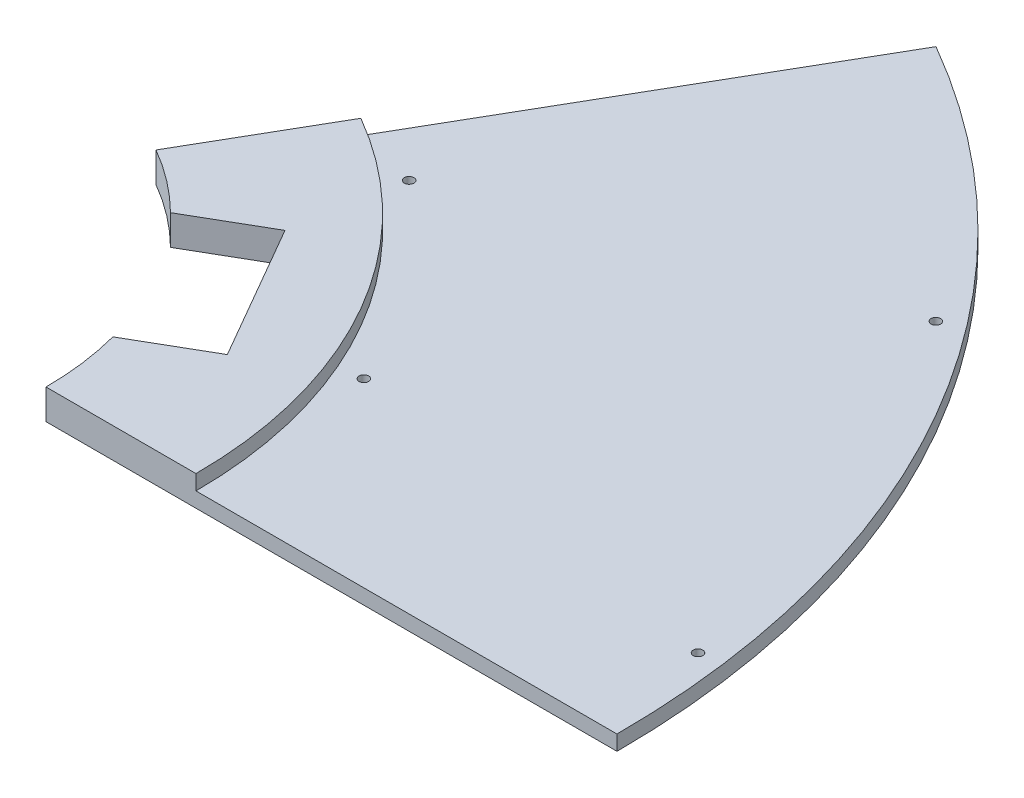
ISO-10303-21;
HEADER;
FILE_DESCRIPTION(('STEP AP214'),'2;1');
FILE_NAME('part.step','',(''),(''),'','','');
FILE_SCHEMA(('AUTOMOTIVE_DESIGN { 1 0 10303 214 1 1 1 1 }'));
ENDSEC;
DATA;
#1=APPLICATION_CONTEXT('core data for automotive mechanical design processes');
#2=APPLICATION_PROTOCOL_DEFINITION('international standard','automotive_design',2000,#1);
#3=PRODUCT_CONTEXT('',#1,'mechanical');
#4=PRODUCT('Part','Part','',(#3));
#5=PRODUCT_RELATED_PRODUCT_CATEGORY('part','',(#4));
#6=PRODUCT_DEFINITION_FORMATION('','',#4);
#7=PRODUCT_DEFINITION_CONTEXT('part definition',#1,'design');
#8=PRODUCT_DEFINITION('design','',#6,#7);
#9=PRODUCT_DEFINITION_SHAPE('','',#8);
#10=(LENGTH_UNIT() NAMED_UNIT(*) SI_UNIT(.MILLI.,.METRE.));
#11=(NAMED_UNIT(*) PLANE_ANGLE_UNIT() SI_UNIT($,.RADIAN.));
#12=(NAMED_UNIT(*) SI_UNIT($,.STERADIAN.) SOLID_ANGLE_UNIT());
#13=UNCERTAINTY_MEASURE_WITH_UNIT(LENGTH_MEASURE(1.E-05),#10,'distance_accuracy_value','');
#14=(GEOMETRIC_REPRESENTATION_CONTEXT(3) GLOBAL_UNCERTAINTY_ASSIGNED_CONTEXT((#13)) GLOBAL_UNIT_ASSIGNED_CONTEXT((#10,
#11,#12)) REPRESENTATION_CONTEXT('',''));
#15=CARTESIAN_POINT('',(0.,0.,0.));
#16=DIRECTION('',(0.,0.,1.));
#17=DIRECTION('',(1.,0.,0.));
#18=AXIS2_PLACEMENT_3D('',#15,#16,#17);
#19=CARTESIAN_POINT('',(0.,5.,0.));
#20=DIRECTION('',(0.86602540378444,0.,0.499999999999998));
#21=DIRECTION('',(0.499999999999998,0.,-0.86602540378444));
#22=AXIS2_PLACEMENT_3D('',#19,#20,#21);
#23=PLANE('',#22);
#24=DIRECTION('',(-0.499999999999998,0.,0.86602540378444));
#25=VECTOR('',#24,1.);
#26=CARTESIAN_POINT('',(0.,0.,0.));
#27=LINE('',#26,#25);
#28=CARTESIAN_POINT('',(144.999999999999,0.,-251.147367097488));
#29=VERTEX_POINT('',#28);
#30=CARTESIAN_POINT('',(49.9999999999993,0.,-86.6025403784443));
#31=VERTEX_POINT('',#30);
#32=EDGE_CURVE('E138',#29,#31,#27,.T.);
#33=ORIENTED_EDGE('',*,*,#32,.T.);
#34=DIRECTION('',(0.,1.,0.));
#35=VECTOR('',#34,1.);
#36=CARTESIAN_POINT('',(49.9999999999993,0.,-86.6025403784443));
#37=LINE('',#36,#35);
#38=CARTESIAN_POINT('',(49.9999999999993,10.,-86.6025403784443));
#39=VERTEX_POINT('',#38);
#40=EDGE_CURVE('E132',#31,#39,#37,.T.);
#41=ORIENTED_EDGE('',*,*,#40,.T.);
#42=DIRECTION('',(-0.499999999999996,0.,0.866025403784441));
#43=VECTOR('',#42,1.);
#44=CARTESIAN_POINT('',(74.9499999999993,10.,-129.817208027288));
#45=LINE('',#44,#43);
#46=CARTESIAN_POINT('',(74.9499999999993,10.,-129.817208027288));
#47=VERTEX_POINT('',#46);
#48=EDGE_CURVE('E278',#47,#39,#45,.T.);
#49=ORIENTED_EDGE('',*,*,#48,.F.);
#50=DIRECTION('',(0.,-1.,0.));
#51=VECTOR('',#50,1.);
#52=CARTESIAN_POINT('',(74.9499999999993,10.,-129.817208027288));
#53=LINE('',#52,#51);
#54=CARTESIAN_POINT('',(74.9499999999993,5.,-129.817208027288));
#55=VERTEX_POINT('',#54);
#56=EDGE_CURVE('E284',#47,#55,#53,.T.);
#57=ORIENTED_EDGE('',*,*,#56,.T.);
#58=DIRECTION('',(-0.499999999999998,0.,0.86602540378444));
#59=VECTOR('',#58,1.);
#60=CARTESIAN_POINT('',(0.,5.,0.));
#61=LINE('',#60,#59);
#62=CARTESIAN_POINT('',(144.999999999999,5.,-251.147367097488));
#63=VERTEX_POINT('',#62);
#64=EDGE_CURVE('E140',#63,#55,#61,.T.);
#65=ORIENTED_EDGE('',*,*,#64,.F.);
#66=DIRECTION('',(0.,-1.,0.));
#67=VECTOR('',#66,1.);
#68=CARTESIAN_POINT('',(144.999999999999,5.,-251.147367097488));
#69=LINE('',#68,#67);
#70=EDGE_CURVE('E147',#63,#29,#69,.T.);
#71=ORIENTED_EDGE('',*,*,#70,.T.);
#72=EDGE_LOOP('',(#33,#41,#49,#57,#65,#71));
#73=FACE_BOUND('',#72,.T.);
#74=ADVANCED_FACE('F39',(#73),#23,.F.);
#75=CARTESIAN_POINT('',(0.,5.,0.));
#76=DIRECTION('',(0.,0.,-1.));
#77=DIRECTION('',(-1.,0.,0.));
#78=AXIS2_PLACEMENT_3D('',#75,#76,#77);
#79=PLANE('',#78);
#80=DIRECTION('',(1.,0.,0.));
#81=VECTOR('',#80,1.);
#82=CARTESIAN_POINT('',(0.,10.,0.));
#83=LINE('',#82,#81);
#84=CARTESIAN_POINT('',(100.,10.,0.));
#85=VERTEX_POINT('',#84);
#86=CARTESIAN_POINT('',(149.9,10.,0.));
#87=VERTEX_POINT('',#86);
#88=EDGE_CURVE('E131',#85,#87,#83,.T.);
#89=ORIENTED_EDGE('',*,*,#88,.F.);
#90=DIRECTION('',(0.,1.,0.));
#91=VECTOR('',#90,1.);
#92=CARTESIAN_POINT('',(100.,0.,0.));
#93=LINE('',#92,#91);
#94=CARTESIAN_POINT('',(100.,0.,0.));
#95=VERTEX_POINT('',#94);
#96=EDGE_CURVE('E118',#95,#85,#93,.T.);
#97=ORIENTED_EDGE('',*,*,#96,.F.);
#98=DIRECTION('',(1.,0.,0.));
#99=VECTOR('',#98,1.);
#100=CARTESIAN_POINT('',(0.,0.,0.));
#101=LINE('',#100,#99);
#102=CARTESIAN_POINT('',(290.,0.,0.));
#103=VERTEX_POINT('',#102);
#104=EDGE_CURVE('E128',#95,#103,#101,.T.);
#105=ORIENTED_EDGE('',*,*,#104,.T.);
#106=DIRECTION('',(0.,-1.,0.));
#107=VECTOR('',#106,1.);
#108=CARTESIAN_POINT('',(290.,5.,0.));
#109=LINE('',#108,#107);
#110=CARTESIAN_POINT('',(290.,5.,0.));
#111=VERTEX_POINT('',#110);
#112=EDGE_CURVE('E150',#111,#103,#109,.T.);
#113=ORIENTED_EDGE('',*,*,#112,.F.);
#114=DIRECTION('',(1.,0.,0.));
#115=VECTOR('',#114,1.);
#116=CARTESIAN_POINT('',(0.,5.,0.));
#117=LINE('',#116,#115);
#118=CARTESIAN_POINT('',(149.9,5.,0.));
#119=VERTEX_POINT('',#118);
#120=EDGE_CURVE('E292',#119,#111,#117,.T.);
#121=ORIENTED_EDGE('',*,*,#120,.F.);
#122=DIRECTION('',(0.,-1.,0.));
#123=VECTOR('',#122,1.);
#124=CARTESIAN_POINT('',(149.9,10.,0.));
#125=LINE('',#124,#123);
#126=EDGE_CURVE('E143',#87,#119,#125,.T.);
#127=ORIENTED_EDGE('',*,*,#126,.F.);
#128=EDGE_LOOP('',(#89,#97,#105,#113,#121,#127));
#129=FACE_BOUND('',#128,.T.);
#130=ADVANCED_FACE('F126',(#129),#79,.F.);
#131=CARTESIAN_POINT('',(0.,5.,0.));
#132=DIRECTION('',(0.,-1.,0.));
#133=DIRECTION('',(0.,0.,-1.));
#134=AXIS2_PLACEMENT_3D('',#131,#132,#133);
#135=CYLINDRICAL_SURFACE('',#134,290.);
#136=CARTESIAN_POINT('',(0.,0.,0.));
#137=DIRECTION('',(0.,1.,0.));
#138=DIRECTION('',(0.,0.,1.));
#139=AXIS2_PLACEMENT_3D('',#136,#137,#138);
#140=CIRCLE('',#139,290.);
#141=EDGE_CURVE('E137',#103,#29,#140,.T.);
#142=ORIENTED_EDGE('',*,*,#141,.T.);
#143=ORIENTED_EDGE('',*,*,#70,.F.);
#144=CARTESIAN_POINT('',(0.,5.,0.));
#145=DIRECTION('',(0.,1.,0.));
#146=DIRECTION('',(0.,0.,1.));
#147=AXIS2_PLACEMENT_3D('',#144,#145,#146);
#148=CIRCLE('',#147,290.);
#149=EDGE_CURVE('E151',#111,#63,#148,.T.);
#150=ORIENTED_EDGE('',*,*,#149,.F.);
#151=ORIENTED_EDGE('',*,*,#112,.T.);
#152=EDGE_LOOP('',(#142,#143,#150,#151));
#153=FACE_BOUND('',#152,.T.);
#154=ADVANCED_FACE('F202',(#153),#135,.T.);
#155=CARTESIAN_POINT('',(0.,5.,0.));
#156=DIRECTION('',(0.,1.,0.));
#157=DIRECTION('',(0.,0.,1.));
#158=AXIS2_PLACEMENT_3D('',#155,#156,#157);
#159=PLANE('',#158);
#160=CARTESIAN_POINT('',(95.8799250688732,5.,-124.95315109587));
#161=DIRECTION('',(0.,1.,0.));
#162=DIRECTION('',(0.,0.,1.));
#163=AXIS2_PLACEMENT_3D('',#160,#161,#162);
#164=CIRCLE('',#163,1.60000000000001);
#165=CARTESIAN_POINT('',(95.8799250688732,5.,-123.35315109587));
#166=VERTEX_POINT('',#165);
#167=EDGE_CURVE('E239',#166,#166,#164,.T.);
#168=ORIENTED_EDGE('',*,*,#167,.F.);
#169=EDGE_LOOP('',(#168));
#170=FACE_BOUND('',#169,.T.);
#171=CARTESIAN_POINT('',(224.122318632275,5.,-171.975103694962));
#172=DIRECTION('',(0.,1.,0.));
#173=DIRECTION('',(0.,0.,1.));
#174=AXIS2_PLACEMENT_3D('',#171,#172,#173);
#175=CIRCLE('',#174,1.59999999999999);
#176=CARTESIAN_POINT('',(224.122318632275,5.,-170.375103694962));
#177=VERTEX_POINT('',#176);
#178=EDGE_CURVE('E237',#177,#177,#175,.T.);
#179=ORIENTED_EDGE('',*,*,#178,.F.);
#180=EDGE_LOOP('',(#179));
#181=FACE_BOUND('',#180,.T.);
#182=CARTESIAN_POINT('',(145.511026370528,5.,-60.2726405975017));
#183=DIRECTION('',(0.,1.,0.));
#184=DIRECTION('',(0.,0.,1.));
#185=AXIS2_PLACEMENT_3D('',#182,#183,#184);
#186=CIRCLE('',#185,1.59999999999999);
#187=CARTESIAN_POINT('',(145.511026370528,5.,-58.6726405975017));
#188=VERTEX_POINT('',#187);
#189=EDGE_CURVE('E240',#188,#188,#186,.T.);
#190=ORIENTED_EDGE('',*,*,#189,.F.);
#191=EDGE_LOOP('',(#190));
#192=FACE_BOUND('',#191,.T.);
#193=CARTESIAN_POINT('',(280.083173338102,5.,-36.8736493021627));
#194=DIRECTION('',(0.,1.,0.));
#195=DIRECTION('',(0.,0.,1.));
#196=AXIS2_PLACEMENT_3D('',#193,#194,#195);
#197=CIRCLE('',#196,1.59999999999996);
#198=CARTESIAN_POINT('',(280.083173338102,5.,-35.2736493021627));
#199=VERTEX_POINT('',#198);
#200=EDGE_CURVE('E246',#199,#199,#197,.T.);
#201=ORIENTED_EDGE('',*,*,#200,.F.);
#202=EDGE_LOOP('',(#201));
#203=FACE_BOUND('',#202,.T.);
#204=CARTESIAN_POINT('',(0.,5.,0.));
#205=DIRECTION('',(0.,1.,0.));
#206=DIRECTION('',(0.,0.,-1.));
#207=AXIS2_PLACEMENT_3D('',#204,#205,#206);
#208=CIRCLE('',#207,149.9);
#209=EDGE_CURVE('E275',#119,#55,#208,.T.);
#210=ORIENTED_EDGE('',*,*,#209,.F.);
#211=ORIENTED_EDGE('',*,*,#120,.T.);
#212=ORIENTED_EDGE('',*,*,#149,.T.);
#213=ORIENTED_EDGE('',*,*,#64,.T.);
#214=EDGE_LOOP('',(#210,#211,#212,#213));
#215=FACE_BOUND('',#214,.T.);
#216=ADVANCED_FACE('F186',(#170,#181,#192,#203,#215),#159,.T.);
#217=CARTESIAN_POINT('',(0.,0.,0.));
#218=DIRECTION('',(0.,1.,0.));
#219=DIRECTION('',(0.,0.,1.));
#220=AXIS2_PLACEMENT_3D('',#217,#218,#219);
#221=PLANE('',#220);
#222=CARTESIAN_POINT('',(280.083173338102,0.,-36.8736493021627));
#223=DIRECTION('',(0.,1.,0.));
#224=DIRECTION('',(0.,0.,1.));
#225=AXIS2_PLACEMENT_3D('',#222,#223,#224);
#226=CIRCLE('',#225,3.59999999999994);
#227=CARTESIAN_POINT('',(280.083173338102,0.,-33.2736493021628));
#228=VERTEX_POINT('',#227);
#229=EDGE_CURVE('E163',#228,#228,#226,.T.);
#230=ORIENTED_EDGE('',*,*,#229,.T.);
#231=EDGE_LOOP('',(#230));
#232=FACE_BOUND('',#231,.T.);
#233=CARTESIAN_POINT('',(224.122318632275,0.,-171.975103694962));
#234=DIRECTION('',(0.,1.,0.));
#235=DIRECTION('',(0.,0.,1.));
#236=AXIS2_PLACEMENT_3D('',#233,#234,#235);
#237=CIRCLE('',#236,3.60000000000005);
#238=CARTESIAN_POINT('',(224.122318632275,0.,-168.375103694962));
#239=VERTEX_POINT('',#238);
#240=EDGE_CURVE('E160',#239,#239,#237,.T.);
#241=ORIENTED_EDGE('',*,*,#240,.T.);
#242=EDGE_LOOP('',(#241));
#243=FACE_BOUND('',#242,.T.);
#244=CARTESIAN_POINT('',(95.8799250688732,0.,-124.95315109587));
#245=DIRECTION('',(0.,1.,0.));
#246=DIRECTION('',(0.,0.,1.));
#247=AXIS2_PLACEMENT_3D('',#244,#245,#246);
#248=CIRCLE('',#247,3.59999999999998);
#249=CARTESIAN_POINT('',(95.8799250688732,0.,-121.35315109587));
#250=VERTEX_POINT('',#249);
#251=EDGE_CURVE('E157',#250,#250,#248,.T.);
#252=ORIENTED_EDGE('',*,*,#251,.T.);
#253=EDGE_LOOP('',(#252));
#254=FACE_BOUND('',#253,.T.);
#255=CARTESIAN_POINT('',(145.511026370528,0.,-60.2726405975017));
#256=DIRECTION('',(0.,1.,0.));
#257=DIRECTION('',(0.,0.,1.));
#258=AXIS2_PLACEMENT_3D('',#255,#256,#257);
#259=CIRCLE('',#258,3.59999999999994);
#260=CARTESIAN_POINT('',(145.511026370528,0.,-56.6726405975018));
#261=VERTEX_POINT('',#260);
#262=EDGE_CURVE('E154',#261,#261,#259,.T.);
#263=ORIENTED_EDGE('',*,*,#262,.T.);
#264=EDGE_LOOP('',(#263));
#265=FACE_BOUND('',#264,.T.);
#266=ORIENTED_EDGE('',*,*,#104,.F.);
#267=CARTESIAN_POINT('',(0.,0.,0.));
#268=DIRECTION('',(0.,1.,0.));
#269=DIRECTION('',(0.,0.,-1.));
#270=AXIS2_PLACEMENT_3D('',#267,#268,#269);
#271=CIRCLE('',#270,100.);
#272=CARTESIAN_POINT('',(96.6773294620018,0.,-25.5635280838847));
#273=VERTEX_POINT('',#272);
#274=EDGE_CURVE('E115',#95,#273,#271,.T.);
#275=ORIENTED_EDGE('',*,*,#274,.T.);
#276=DIRECTION('',(0.866025403784437,0.,-0.500000000000002));
#277=VECTOR('',#276,1.);
#278=CARTESIAN_POINT('',(120.833560230784,0.,-39.510134420848));
#279=LINE('',#278,#277);
#280=CARTESIAN_POINT('',(120.833560230784,0.,-39.510134420848));
#281=VERTEX_POINT('',#280);
#282=EDGE_CURVE('E257',#273,#281,#279,.T.);
#283=ORIENTED_EDGE('',*,*,#282,.T.);
#284=DIRECTION('',(-0.500000000000002,0.,-0.866025403784437));
#285=VECTOR('',#284,1.);
#286=CARTESIAN_POINT('',(94.633560230784,0.,-84.8898655791526));
#287=LINE('',#286,#285);
#288=CARTESIAN_POINT('',(94.633560230784,0.,-84.8898655791526));
#289=VERTEX_POINT('',#288);
#290=EDGE_CURVE('E259',#281,#289,#287,.T.);
#291=ORIENTED_EDGE('',*,*,#290,.T.);
#292=DIRECTION('',(-0.866025403784437,0.,0.500000000000002));
#293=VECTOR('',#292,1.);
#294=CARTESIAN_POINT('',(26.1999999999997,0.,-45.3797311583045));
#295=LINE('',#294,#293);
#296=CARTESIAN_POINT('',(70.4773294620017,0.,-70.9432592421893));
#297=VERTEX_POINT('',#296);
#298=EDGE_CURVE('E263',#289,#297,#295,.T.);
#299=ORIENTED_EDGE('',*,*,#298,.T.);
#300=EDGE_CURVE('E55',#297,#31,#271,.T.);
#301=ORIENTED_EDGE('',*,*,#300,.T.);
#302=ORIENTED_EDGE('',*,*,#32,.F.);
#303=ORIENTED_EDGE('',*,*,#141,.F.);
#304=EDGE_LOOP('',(#266,#275,#283,#291,#299,#301,#302,#303));
#305=FACE_BOUND('',#304,.T.);
#306=ADVANCED_FACE('F135',(#232,#243,#254,#265,#305),#221,.F.);
#307=CARTESIAN_POINT('',(0.,10.,0.));
#308=DIRECTION('',(0.,-1.,0.));
#309=DIRECTION('',(0.,0.,-1.));
#310=AXIS2_PLACEMENT_3D('',#307,#308,#309);
#311=CYLINDRICAL_SURFACE('',#310,149.9);
#312=ORIENTED_EDGE('',*,*,#209,.T.);
#313=ORIENTED_EDGE('',*,*,#56,.F.);
#314=CARTESIAN_POINT('',(0.,10.,0.));
#315=DIRECTION('',(0.,1.,0.));
#316=DIRECTION('',(0.,0.,-1.));
#317=AXIS2_PLACEMENT_3D('',#314,#315,#316);
#318=CIRCLE('',#317,149.9);
#319=EDGE_CURVE('E282',#87,#47,#318,.T.);
#320=ORIENTED_EDGE('',*,*,#319,.F.);
#321=ORIENTED_EDGE('',*,*,#126,.T.);
#322=EDGE_LOOP('',(#312,#313,#320,#321));
#323=FACE_BOUND('',#322,.T.);
#324=ADVANCED_FACE('F185',(#323),#311,.T.);
#325=CARTESIAN_POINT('',(0.,10.,0.));
#326=DIRECTION('',(0.,-1.,0.));
#327=DIRECTION('',(0.,0.,-1.));
#328=AXIS2_PLACEMENT_3D('',#325,#326,#327);
#329=PLANE('',#328);
#330=ORIENTED_EDGE('',*,*,#48,.T.);
#331=CARTESIAN_POINT('',(0.,10.,0.));
#332=DIRECTION('',(0.,1.,0.));
#333=DIRECTION('',(0.,0.,-1.));
#334=AXIS2_PLACEMENT_3D('',#331,#332,#333);
#335=CIRCLE('',#334,100.);
#336=CARTESIAN_POINT('',(70.4773294620017,10.,-70.9432592421893));
#337=VERTEX_POINT('',#336);
#338=EDGE_CURVE('E243',#337,#39,#335,.T.);
#339=ORIENTED_EDGE('',*,*,#338,.F.);
#340=DIRECTION('',(-0.866025403784437,0.,0.500000000000002));
#341=VECTOR('',#340,1.);
#342=CARTESIAN_POINT('',(26.1999999999997,10.,-45.3797311583045));
#343=LINE('',#342,#341);
#344=CARTESIAN_POINT('',(94.633560230784,10.,-84.8898655791526));
#345=VERTEX_POINT('',#344);
#346=EDGE_CURVE('E260',#345,#337,#343,.T.);
#347=ORIENTED_EDGE('',*,*,#346,.F.);
#348=DIRECTION('',(-0.500000000000002,0.,-0.866025403784437));
#349=VECTOR('',#348,1.);
#350=CARTESIAN_POINT('',(94.633560230784,10.,-84.8898655791526));
#351=LINE('',#350,#349);
#352=CARTESIAN_POINT('',(120.833560230784,10.,-39.510134420848));
#353=VERTEX_POINT('',#352);
#354=EDGE_CURVE('E268',#353,#345,#351,.T.);
#355=ORIENTED_EDGE('',*,*,#354,.F.);
#356=DIRECTION('',(0.866025403784437,0.,-0.500000000000002));
#357=VECTOR('',#356,1.);
#358=CARTESIAN_POINT('',(120.833560230784,10.,-39.510134420848));
#359=LINE('',#358,#357);
#360=CARTESIAN_POINT('',(96.6773294620018,10.,-25.5635280838847));
#361=VERTEX_POINT('',#360);
#362=EDGE_CURVE('E256',#361,#353,#359,.T.);
#363=ORIENTED_EDGE('',*,*,#362,.F.);
#364=EDGE_CURVE('E63',#85,#361,#335,.T.);
#365=ORIENTED_EDGE('',*,*,#364,.F.);
#366=ORIENTED_EDGE('',*,*,#88,.T.);
#367=ORIENTED_EDGE('',*,*,#319,.T.);
#368=EDGE_LOOP('',(#330,#339,#347,#355,#363,#365,#366,#367));
#369=FACE_BOUND('',#368,.T.);
#370=ADVANCED_FACE('F304',(#369),#329,.F.);
#371=CARTESIAN_POINT('',(26.1999999999997,0.,-45.3797311583045));
#372=DIRECTION('',(-0.500000000000003,0.,-0.866025403784437));
#373=DIRECTION('',(-0.866025403784437,0.,0.500000000000003));
#374=AXIS2_PLACEMENT_3D('',#371,#372,#373);
#375=PLANE('',#374);
#376=ORIENTED_EDGE('',*,*,#346,.T.);
#377=DIRECTION('',(0.,1.,0.));
#378=VECTOR('',#377,1.);
#379=CARTESIAN_POINT('',(70.4773294620017,0.,-70.9432592421893));
#380=LINE('',#379,#378);
#381=EDGE_CURVE('E253',#337,#297,#380,.F.);
#382=ORIENTED_EDGE('',*,*,#381,.T.);
#383=ORIENTED_EDGE('',*,*,#298,.F.);
#384=DIRECTION('',(0.,1.,0.));
#385=VECTOR('',#384,1.);
#386=CARTESIAN_POINT('',(94.633560230784,0.,-84.8898655791526));
#387=LINE('',#386,#385);
#388=EDGE_CURVE('E273',#289,#345,#387,.T.);
#389=ORIENTED_EDGE('',*,*,#388,.T.);
#390=EDGE_LOOP('',(#376,#382,#383,#389));
#391=FACE_BOUND('',#390,.T.);
#392=ADVANCED_FACE('F317',(#391),#375,.F.);
#393=CARTESIAN_POINT('',(94.633560230784,0.,-84.8898655791526));
#394=DIRECTION('',(0.866025403784437,0.,-0.500000000000002));
#395=DIRECTION('',(-0.500000000000002,0.,-0.866025403784437));
#396=AXIS2_PLACEMENT_3D('',#393,#394,#395);
#397=PLANE('',#396);
#398=ORIENTED_EDGE('',*,*,#354,.T.);
#399=ORIENTED_EDGE('',*,*,#388,.F.);
#400=ORIENTED_EDGE('',*,*,#290,.F.);
#401=DIRECTION('',(0.,1.,0.));
#402=VECTOR('',#401,1.);
#403=CARTESIAN_POINT('',(120.833560230784,0.,-39.510134420848));
#404=LINE('',#403,#402);
#405=EDGE_CURVE('E266',#281,#353,#404,.T.);
#406=ORIENTED_EDGE('',*,*,#405,.T.);
#407=EDGE_LOOP('',(#398,#399,#400,#406));
#408=FACE_BOUND('',#407,.T.);
#409=ADVANCED_FACE('F314',(#408),#397,.F.);
#410=CARTESIAN_POINT('',(120.833560230784,0.,-39.510134420848));
#411=DIRECTION('',(0.500000000000002,0.,0.866025403784437));
#412=DIRECTION('',(0.866025403784437,0.,-0.500000000000002));
#413=AXIS2_PLACEMENT_3D('',#410,#411,#412);
#414=PLANE('',#413);
#415=ORIENTED_EDGE('',*,*,#282,.F.);
#416=DIRECTION('',(0.,1.,0.));
#417=VECTOR('',#416,1.);
#418=CARTESIAN_POINT('',(96.6773294620018,0.,-25.5635280838847));
#419=LINE('',#418,#417);
#420=EDGE_CURVE('E119',#273,#361,#419,.T.);
#421=ORIENTED_EDGE('',*,*,#420,.T.);
#422=ORIENTED_EDGE('',*,*,#362,.T.);
#423=ORIENTED_EDGE('',*,*,#405,.F.);
#424=EDGE_LOOP('',(#415,#421,#422,#423));
#425=FACE_BOUND('',#424,.T.);
#426=ADVANCED_FACE('F311',(#425),#414,.F.);
#427=CARTESIAN_POINT('',(0.,0.,0.));
#428=DIRECTION('',(0.,1.,0.));
#429=DIRECTION('',(0.,0.,1.));
#430=AXIS2_PLACEMENT_3D('',#427,#428,#429);
#431=CYLINDRICAL_SURFACE('',#430,100.);
#432=ORIENTED_EDGE('',*,*,#274,.F.);
#433=ORIENTED_EDGE('',*,*,#96,.T.);
#434=ORIENTED_EDGE('',*,*,#364,.T.);
#435=ORIENTED_EDGE('',*,*,#420,.F.);
#436=EDGE_LOOP('',(#432,#433,#434,#435));
#437=FACE_BOUND('',#436,.T.);
#438=ADVANCED_FACE('F117',(#437),#431,.F.);
#439=ORIENTED_EDGE('',*,*,#338,.T.);
#440=ORIENTED_EDGE('',*,*,#40,.F.);
#441=ORIENTED_EDGE('',*,*,#300,.F.);
#442=ORIENTED_EDGE('',*,*,#381,.F.);
#443=EDGE_LOOP('',(#439,#440,#441,#442));
#444=FACE_BOUND('',#443,.T.);
#445=ADVANCED_FACE('F318',(#444),#431,.F.);
#446=CARTESIAN_POINT('',(280.083173338102,0.,-36.8736493021627));
#447=DIRECTION('',(0.,1.,0.));
#448=DIRECTION('',(0.,0.,1.));
#449=AXIS2_PLACEMENT_3D('',#446,#447,#448);
#450=CYLINDRICAL_SURFACE('',#449,1.59999999999996);
#451=CARTESIAN_POINT('',(280.083173338102,1.99999999999999,-36.8736493021627));
#452=DIRECTION('',(0.,1.,0.));
#453=DIRECTION('',(0.,0.,1.));
#454=AXIS2_PLACEMENT_3D('',#451,#452,#453);
#455=CIRCLE('',#454,1.59999999999996);
#456=CARTESIAN_POINT('',(280.083173338102,1.99999999999999,-35.2736493021627));
#457=VERTEX_POINT('',#456);
#458=EDGE_CURVE('E166',#457,#457,#455,.F.);
#459=ORIENTED_EDGE('',*,*,#458,.T.);
#460=EDGE_LOOP('',(#459));
#461=FACE_BOUND('',#460,.T.);
#462=ORIENTED_EDGE('',*,*,#200,.T.);
#463=EDGE_LOOP('',(#462));
#464=FACE_BOUND('',#463,.T.);
#465=ADVANCED_FACE('F320',(#461,#464),#450,.F.);
#466=CARTESIAN_POINT('',(145.511026370528,0.,-60.2726405975017));
#467=DIRECTION('',(0.,1.,0.));
#468=DIRECTION('',(0.,0.,1.));
#469=AXIS2_PLACEMENT_3D('',#466,#467,#468);
#470=CYLINDRICAL_SURFACE('',#469,1.59999999999999);
#471=CARTESIAN_POINT('',(145.511026370528,1.99999999999997,-60.2726405975017));
#472=DIRECTION('',(0.,1.,0.));
#473=DIRECTION('',(0.,0.,1.));
#474=AXIS2_PLACEMENT_3D('',#471,#472,#473);
#475=CIRCLE('',#474,1.59999999999999);
#476=CARTESIAN_POINT('',(145.511026370528,1.99999999999997,-58.6726405975017));
#477=VERTEX_POINT('',#476);
#478=EDGE_CURVE('E11',#477,#477,#475,.F.);
#479=ORIENTED_EDGE('',*,*,#478,.T.);
#480=EDGE_LOOP('',(#479));
#481=FACE_BOUND('',#480,.T.);
#482=ORIENTED_EDGE('',*,*,#189,.T.);
#483=EDGE_LOOP('',(#482));
#484=FACE_BOUND('',#483,.T.);
#485=ADVANCED_FACE('F233',(#481,#484),#470,.F.);
#486=CARTESIAN_POINT('',(224.122318632275,0.,-171.975103694962));
#487=DIRECTION('',(0.,1.,0.));
#488=DIRECTION('',(0.,0.,1.));
#489=AXIS2_PLACEMENT_3D('',#486,#487,#488);
#490=CYLINDRICAL_SURFACE('',#489,1.59999999999999);
#491=CARTESIAN_POINT('',(224.122318632275,2.00000000000006,-171.975103694962));
#492=DIRECTION('',(0.,1.,0.));
#493=DIRECTION('',(0.,0.,1.));
#494=AXIS2_PLACEMENT_3D('',#491,#492,#493);
#495=CIRCLE('',#494,1.59999999999999);
#496=CARTESIAN_POINT('',(224.122318632275,2.00000000000006,-170.375103694962));
#497=VERTEX_POINT('',#496);
#498=EDGE_CURVE('E169',#497,#497,#495,.F.);
#499=ORIENTED_EDGE('',*,*,#498,.T.);
#500=EDGE_LOOP('',(#499));
#501=FACE_BOUND('',#500,.T.);
#502=ORIENTED_EDGE('',*,*,#178,.T.);
#503=EDGE_LOOP('',(#502));
#504=FACE_BOUND('',#503,.T.);
#505=ADVANCED_FACE('F230',(#501,#504),#490,.F.);
#506=CARTESIAN_POINT('',(95.8799250688732,0.,-124.95315109587));
#507=DIRECTION('',(0.,1.,0.));
#508=DIRECTION('',(0.,0.,1.));
#509=AXIS2_PLACEMENT_3D('',#506,#507,#508);
#510=CYLINDRICAL_SURFACE('',#509,1.60000000000001);
#511=CARTESIAN_POINT('',(95.8799250688732,1.99999999999999,-124.95315109587));
#512=DIRECTION('',(0.,1.,0.));
#513=DIRECTION('',(0.,0.,1.));
#514=AXIS2_PLACEMENT_3D('',#511,#512,#513);
#515=CIRCLE('',#514,1.60000000000001);
#516=CARTESIAN_POINT('',(95.8799250688732,1.99999999999999,-123.35315109587));
#517=VERTEX_POINT('',#516);
#518=EDGE_CURVE('E48',#517,#517,#515,.F.);
#519=ORIENTED_EDGE('',*,*,#518,.T.);
#520=EDGE_LOOP('',(#519));
#521=FACE_BOUND('',#520,.T.);
#522=ORIENTED_EDGE('',*,*,#167,.T.);
#523=EDGE_LOOP('',(#522));
#524=FACE_BOUND('',#523,.T.);
#525=ADVANCED_FACE('F174',(#521,#524),#510,.F.);
#526=CARTESIAN_POINT('',(280.083173338102,0.,-36.8736493021627));
#527=DIRECTION('',(0.,-1.,0.));
#528=DIRECTION('',(0.,0.,-1.));
#529=AXIS2_PLACEMENT_3D('',#526,#527,#528);
#530=CONICAL_SURFACE('',#529,3.59999999999994,0.785398163397443);
#531=ORIENTED_EDGE('',*,*,#458,.F.);
#532=EDGE_LOOP('',(#531));
#533=FACE_BOUND('',#532,.T.);
#534=ORIENTED_EDGE('',*,*,#229,.F.);
#535=EDGE_LOOP('',(#534));
#536=FACE_BOUND('',#535,.T.);
#537=ADVANCED_FACE('F207',(#533,#536),#530,.F.);
#538=CARTESIAN_POINT('',(224.122318632275,0.,-171.975103694962));
#539=DIRECTION('',(0.,-1.,0.));
#540=DIRECTION('',(0.,0.,-1.));
#541=AXIS2_PLACEMENT_3D('',#538,#539,#540);
#542=CONICAL_SURFACE('',#541,3.60000000000005,0.785398163397447);
#543=ORIENTED_EDGE('',*,*,#498,.F.);
#544=EDGE_LOOP('',(#543));
#545=FACE_BOUND('',#544,.T.);
#546=ORIENTED_EDGE('',*,*,#240,.F.);
#547=EDGE_LOOP('',(#546));
#548=FACE_BOUND('',#547,.T.);
#549=ADVANCED_FACE('F180',(#545,#548),#542,.F.);
#550=CARTESIAN_POINT('',(95.8799250688732,0.,-124.95315109587));
#551=DIRECTION('',(0.,-1.,0.));
#552=DIRECTION('',(0.,0.,-1.));
#553=AXIS2_PLACEMENT_3D('',#550,#551,#552);
#554=CONICAL_SURFACE('',#553,3.59999999999998,0.785398163397444);
#555=ORIENTED_EDGE('',*,*,#518,.F.);
#556=EDGE_LOOP('',(#555));
#557=FACE_BOUND('',#556,.T.);
#558=ORIENTED_EDGE('',*,*,#251,.F.);
#559=EDGE_LOOP('',(#558));
#560=FACE_BOUND('',#559,.T.);
#561=ADVANCED_FACE('F177',(#557,#560),#554,.F.);
#562=CARTESIAN_POINT('',(145.511026370528,0.,-60.2726405975017));
#563=DIRECTION('',(0.,-1.,0.));
#564=DIRECTION('',(0.,0.,-1.));
#565=AXIS2_PLACEMENT_3D('',#562,#563,#564);
#566=CONICAL_SURFACE('',#565,3.59999999999994,0.785398163397444);
#567=ORIENTED_EDGE('',*,*,#478,.F.);
#568=EDGE_LOOP('',(#567));
#569=FACE_BOUND('',#568,.T.);
#570=ORIENTED_EDGE('',*,*,#262,.F.);
#571=EDGE_LOOP('',(#570));
#572=FACE_BOUND('',#571,.T.);
#573=ADVANCED_FACE('F42',(#569,#572),#566,.F.);
#574=CLOSED_SHELL('',(#74,#130,#154,#216,#306,#324,#370,#392,#409,#426,#438,#445,#465,#485,#505,
#525,#537,#549,#561,#573));
#575=MANIFOLD_SOLID_BREP('B2',#574);
#576=ADVANCED_BREP_SHAPE_REPRESENTATION('',(#18,#575),#14);
#577=SHAPE_DEFINITION_REPRESENTATION(#9,#576);
ENDSEC;
END-ISO-10303-21;
